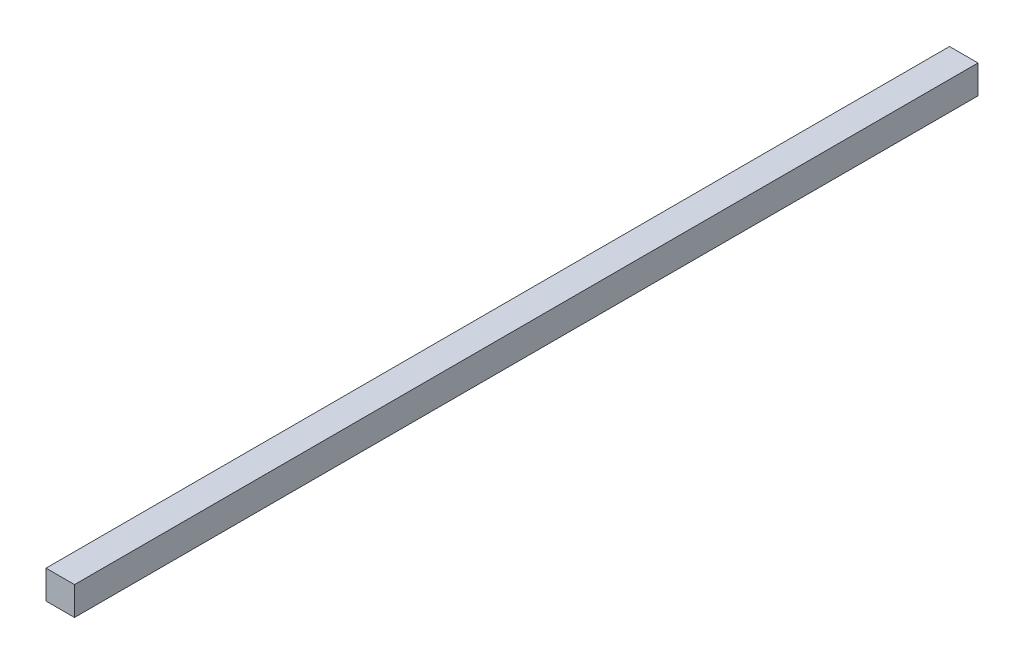
ISO-10303-21;
HEADER;
FILE_DESCRIPTION(('STEP AP214'),'2;1');
FILE_NAME('part.step','',(''),(''),'','','');
FILE_SCHEMA(('AUTOMOTIVE_DESIGN { 1 0 10303 214 1 1 1 1 }'));
ENDSEC;
DATA;
#1=APPLICATION_CONTEXT('core data for automotive mechanical design processes');
#2=APPLICATION_PROTOCOL_DEFINITION('international standard','automotive_design',2000,#1);
#3=PRODUCT_CONTEXT('',#1,'mechanical');
#4=PRODUCT('Part','Part','',(#3));
#5=PRODUCT_RELATED_PRODUCT_CATEGORY('part','',(#4));
#6=PRODUCT_DEFINITION_FORMATION('','',#4);
#7=PRODUCT_DEFINITION_CONTEXT('part definition',#1,'design');
#8=PRODUCT_DEFINITION('design','',#6,#7);
#9=PRODUCT_DEFINITION_SHAPE('','',#8);
#10=(LENGTH_UNIT() NAMED_UNIT(*) SI_UNIT(.MILLI.,.METRE.));
#11=(NAMED_UNIT(*) PLANE_ANGLE_UNIT() SI_UNIT($,.RADIAN.));
#12=(NAMED_UNIT(*) SI_UNIT($,.STERADIAN.) SOLID_ANGLE_UNIT());
#13=UNCERTAINTY_MEASURE_WITH_UNIT(LENGTH_MEASURE(1.E-05),#10,'distance_accuracy_value','');
#14=(GEOMETRIC_REPRESENTATION_CONTEXT(3) GLOBAL_UNCERTAINTY_ASSIGNED_CONTEXT((#13)) GLOBAL_UNIT_ASSIGNED_CONTEXT((#10,
#11,#12)) REPRESENTATION_CONTEXT('',''));
#15=CARTESIAN_POINT('',(0.,0.,0.));
#16=DIRECTION('',(0.,0.,1.));
#17=DIRECTION('',(1.,0.,0.));
#18=AXIS2_PLACEMENT_3D('',#15,#16,#17);
#19=CARTESIAN_POINT('',(65.6740053410367,25.4,0.));
#20=DIRECTION('',(0.,0.,1.));
#21=DIRECTION('',(1.,0.,0.));
#22=AXIS2_PLACEMENT_3D('',#19,#20,#21);
#23=PLANE('',#22);
#24=DIRECTION('',(0.,-1.,0.));
#25=VECTOR('',#24,1.);
#26=CARTESIAN_POINT('',(65.6740053410367,50.8,0.));
#27=LINE('',#26,#25);
#28=CARTESIAN_POINT('',(65.6740053410367,50.8,0.));
#29=VERTEX_POINT('',#28);
#30=CARTESIAN_POINT('',(65.6740053410367,25.4,0.));
#31=VERTEX_POINT('',#30);
#32=EDGE_CURVE('E80',#29,#31,#27,.T.);
#33=ORIENTED_EDGE('',*,*,#32,.F.);
#34=DIRECTION('',(-1.,0.,0.));
#35=VECTOR('',#34,1.);
#36=CARTESIAN_POINT('',(65.6740053410367,50.8,0.));
#37=LINE('',#36,#35);
#38=CARTESIAN_POINT('',(91.0740053410367,50.8,0.));
#39=VERTEX_POINT('',#38);
#40=EDGE_CURVE('E91',#39,#29,#37,.T.);
#41=ORIENTED_EDGE('',*,*,#40,.F.);
#42=DIRECTION('',(0.,1.,0.));
#43=VECTOR('',#42,1.);
#44=CARTESIAN_POINT('',(91.0740053410367,50.8,0.));
#45=LINE('',#44,#43);
#46=CARTESIAN_POINT('',(91.0740053410367,25.4,0.));
#47=VERTEX_POINT('',#46);
#48=EDGE_CURVE('E82',#47,#39,#45,.T.);
#49=ORIENTED_EDGE('',*,*,#48,.F.);
#50=DIRECTION('',(1.,0.,0.));
#51=VECTOR('',#50,1.);
#52=CARTESIAN_POINT('',(65.6740053410367,25.4,0.));
#53=LINE('',#52,#51);
#54=EDGE_CURVE('E72',#31,#47,#53,.T.);
#55=ORIENTED_EDGE('',*,*,#54,.F.);
#56=EDGE_LOOP('',(#33,#41,#49,#55));
#57=FACE_BOUND('',#56,.T.);
#58=ADVANCED_FACE('F31',(#57),#23,.F.);
#59=CARTESIAN_POINT('',(65.6740053410367,50.8,841.101024484276));
#60=DIRECTION('',(0.,-1.,0.));
#61=DIRECTION('',(0.,0.,-1.));
#62=AXIS2_PLACEMENT_3D('',#59,#60,#61);
#63=PLANE('',#62);
#64=DIRECTION('',(0.,0.,-1.));
#65=VECTOR('',#64,1.);
#66=CARTESIAN_POINT('',(65.6740053410367,50.8,841.101024484276));
#67=LINE('',#66,#65);
#68=CARTESIAN_POINT('',(65.6740053410367,50.8,805.18));
#69=VERTEX_POINT('',#68);
#70=EDGE_CURVE('E85',#69,#29,#67,.T.);
#71=ORIENTED_EDGE('',*,*,#70,.F.);
#72=DIRECTION('',(1.,0.,0.));
#73=VECTOR('',#72,1.);
#74=CARTESIAN_POINT('',(65.6740053410367,50.8,805.18));
#75=LINE('',#74,#73);
#76=CARTESIAN_POINT('',(91.0740053410367,50.8,805.18));
#77=VERTEX_POINT('',#76);
#78=EDGE_CURVE('E35',#69,#77,#75,.T.);
#79=ORIENTED_EDGE('',*,*,#78,.T.);
#80=DIRECTION('',(0.,0.,-1.));
#81=VECTOR('',#80,1.);
#82=CARTESIAN_POINT('',(91.0740053410367,50.8,841.101024484276));
#83=LINE('',#82,#81);
#84=EDGE_CURVE('E94',#77,#39,#83,.T.);
#85=ORIENTED_EDGE('',*,*,#84,.T.);
#86=ORIENTED_EDGE('',*,*,#40,.T.);
#87=EDGE_LOOP('',(#71,#79,#85,#86));
#88=FACE_BOUND('',#87,.T.);
#89=ADVANCED_FACE('F104',(#88),#63,.F.);
#90=CARTESIAN_POINT('',(91.0740053410367,50.8,841.101024484276));
#91=DIRECTION('',(-1.,0.,0.));
#92=DIRECTION('',(0.,0.,1.));
#93=AXIS2_PLACEMENT_3D('',#90,#91,#92);
#94=PLANE('',#93);
#95=ORIENTED_EDGE('',*,*,#84,.F.);
#96=DIRECTION('',(0.,-1.,0.));
#97=VECTOR('',#96,1.);
#98=CARTESIAN_POINT('',(91.0740053410367,50.8,805.18));
#99=LINE('',#98,#97);
#100=CARTESIAN_POINT('',(91.0740053410367,25.4,805.18));
#101=VERTEX_POINT('',#100);
#102=EDGE_CURVE('E100',#77,#101,#99,.T.);
#103=ORIENTED_EDGE('',*,*,#102,.T.);
#104=DIRECTION('',(0.,0.,-1.));
#105=VECTOR('',#104,1.);
#106=CARTESIAN_POINT('',(91.0740053410367,25.4,841.101024484276));
#107=LINE('',#106,#105);
#108=EDGE_CURVE('E76',#101,#47,#107,.T.);
#109=ORIENTED_EDGE('',*,*,#108,.T.);
#110=ORIENTED_EDGE('',*,*,#48,.T.);
#111=EDGE_LOOP('',(#95,#103,#109,#110));
#112=FACE_BOUND('',#111,.T.);
#113=ADVANCED_FACE('F99',(#112),#94,.F.);
#114=CARTESIAN_POINT('',(65.6740053410367,25.4,841.101024484276));
#115=DIRECTION('',(0.,1.,0.));
#116=DIRECTION('',(0.,0.,1.));
#117=AXIS2_PLACEMENT_3D('',#114,#115,#116);
#118=PLANE('',#117);
#119=ORIENTED_EDGE('',*,*,#108,.F.);
#120=DIRECTION('',(-1.,0.,0.));
#121=VECTOR('',#120,1.);
#122=CARTESIAN_POINT('',(65.6740053410367,25.4,805.18));
#123=LINE('',#122,#121);
#124=CARTESIAN_POINT('',(65.6740053410367,25.4,805.18));
#125=VERTEX_POINT('',#124);
#126=EDGE_CURVE('E40',#101,#125,#123,.T.);
#127=ORIENTED_EDGE('',*,*,#126,.T.);
#128=DIRECTION('',(0.,0.,-1.));
#129=VECTOR('',#128,1.);
#130=CARTESIAN_POINT('',(65.6740053410367,25.4,841.101024484276));
#131=LINE('',#130,#129);
#132=EDGE_CURVE('E69',#125,#31,#131,.T.);
#133=ORIENTED_EDGE('',*,*,#132,.T.);
#134=ORIENTED_EDGE('',*,*,#54,.T.);
#135=EDGE_LOOP('',(#119,#127,#133,#134));
#136=FACE_BOUND('',#135,.T.);
#137=ADVANCED_FACE('F71',(#136),#118,.F.);
#138=CARTESIAN_POINT('',(65.6740053410367,50.8,841.101024484276));
#139=DIRECTION('',(1.,0.,0.));
#140=DIRECTION('',(0.,0.,-1.));
#141=AXIS2_PLACEMENT_3D('',#138,#139,#140);
#142=PLANE('',#141);
#143=ORIENTED_EDGE('',*,*,#132,.F.);
#144=DIRECTION('',(0.,1.,0.));
#145=VECTOR('',#144,1.);
#146=CARTESIAN_POINT('',(65.6740053410367,50.8,805.18));
#147=LINE('',#146,#145);
#148=EDGE_CURVE('E11',#125,#69,#147,.T.);
#149=ORIENTED_EDGE('',*,*,#148,.T.);
#150=ORIENTED_EDGE('',*,*,#70,.T.);
#151=ORIENTED_EDGE('',*,*,#32,.T.);
#152=EDGE_LOOP('',(#143,#149,#150,#151));
#153=FACE_BOUND('',#152,.T.);
#154=ADVANCED_FACE('F33',(#153),#142,.F.);
#155=CARTESIAN_POINT('',(223.408005341037,57.15,805.18));
#156=DIRECTION('',(0.,0.,-1.));
#157=DIRECTION('',(-1.,0.,0.));
#158=AXIS2_PLACEMENT_3D('',#155,#156,#157);
#159=PLANE('',#158);
#160=ORIENTED_EDGE('',*,*,#126,.F.);
#161=ORIENTED_EDGE('',*,*,#102,.F.);
#162=ORIENTED_EDGE('',*,*,#78,.F.);
#163=ORIENTED_EDGE('',*,*,#148,.F.);
#164=EDGE_LOOP('',(#160,#161,#162,#163));
#165=FACE_BOUND('',#164,.T.);
#166=ADVANCED_FACE('F105',(#165),#159,.F.);
#167=CLOSED_SHELL('',(#58,#89,#113,#137,#154,#166));
#168=MANIFOLD_SOLID_BREP('B2',#167);
#169=ADVANCED_BREP_SHAPE_REPRESENTATION('',(#18,#168),#14);
#170=SHAPE_DEFINITION_REPRESENTATION(#9,#169);
ENDSEC;
END-ISO-10303-21;
